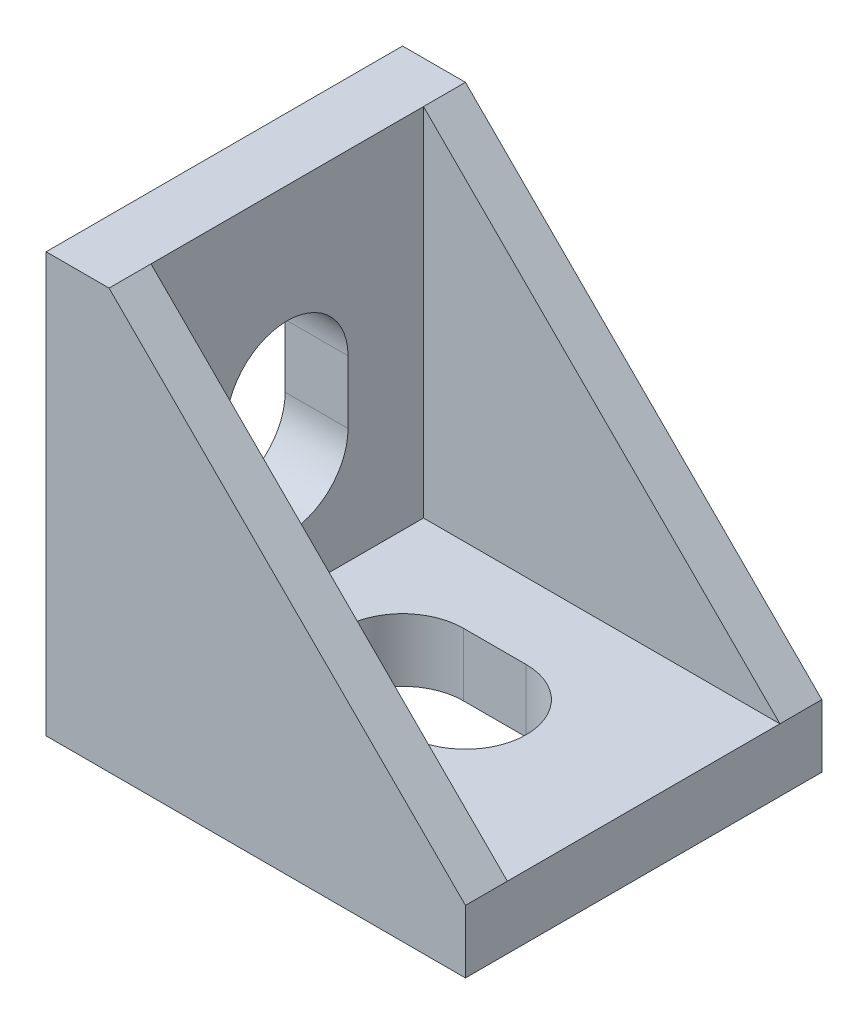
ISO-10303-21;
HEADER;
FILE_DESCRIPTION(('STEP AP214'),'2;1');
FILE_NAME('part.step','',(''),(''),'','','');
FILE_SCHEMA(('AUTOMOTIVE_DESIGN { 1 0 10303 214 1 1 1 1 }'));
ENDSEC;
DATA;
#1=APPLICATION_CONTEXT('core data for automotive mechanical design processes');
#2=APPLICATION_PROTOCOL_DEFINITION('international standard','automotive_design',2000,#1);
#3=PRODUCT_CONTEXT('',#1,'mechanical');
#4=PRODUCT('Part','Part','',(#3));
#5=PRODUCT_RELATED_PRODUCT_CATEGORY('part','',(#4));
#6=PRODUCT_DEFINITION_FORMATION('','',#4);
#7=PRODUCT_DEFINITION_CONTEXT('part definition',#1,'design');
#8=PRODUCT_DEFINITION('design','',#6,#7);
#9=PRODUCT_DEFINITION_SHAPE('','',#8);
#10=(LENGTH_UNIT() NAMED_UNIT(*) SI_UNIT(.MILLI.,.METRE.));
#11=(NAMED_UNIT(*) PLANE_ANGLE_UNIT() SI_UNIT($,.RADIAN.));
#12=(NAMED_UNIT(*) SI_UNIT($,.STERADIAN.) SOLID_ANGLE_UNIT());
#13=UNCERTAINTY_MEASURE_WITH_UNIT(LENGTH_MEASURE(1.E-05),#10,'distance_accuracy_value','');
#14=(GEOMETRIC_REPRESENTATION_CONTEXT(3) GLOBAL_UNCERTAINTY_ASSIGNED_CONTEXT((#13)) GLOBAL_UNIT_ASSIGNED_CONTEXT((#10,
#11,#12)) REPRESENTATION_CONTEXT('',''));
#15=CARTESIAN_POINT('',(0.,0.,0.));
#16=DIRECTION('',(0.,0.,1.));
#17=DIRECTION('',(1.,0.,0.));
#18=AXIS2_PLACEMENT_3D('',#15,#16,#17);
#19=CARTESIAN_POINT('',(0.,0.,8.5));
#20=DIRECTION('',(1.,0.,0.));
#21=DIRECTION('',(0.,0.,-1.));
#22=AXIS2_PLACEMENT_3D('',#19,#20,#21);
#23=PLANE('',#22);
#24=DIRECTION('',(0.,1.,0.));
#25=VECTOR('',#24,1.);
#26=CARTESIAN_POINT('',(0.,18.5,2.));
#27=LINE('',#26,#25);
#28=CARTESIAN_POINT('',(0.,16.65,2.));
#29=VERTEX_POINT('',#28);
#30=CARTESIAN_POINT('',(0.,18.5,2.));
#31=VERTEX_POINT('',#30);
#32=EDGE_CURVE('E221',#29,#31,#27,.T.);
#33=ORIENTED_EDGE('',*,*,#32,.F.);
#34=DIRECTION('',(0.,0.,1.));
#35=VECTOR('',#34,1.);
#36=CARTESIAN_POINT('',(0.,16.65,-2.));
#37=LINE('',#36,#35);
#38=CARTESIAN_POINT('',(0.,16.65,-2.));
#39=VERTEX_POINT('',#38);
#40=EDGE_CURVE('E234',#39,#29,#37,.T.);
#41=ORIENTED_EDGE('',*,*,#40,.F.);
#42=DIRECTION('',(0.,-1.,0.));
#43=VECTOR('',#42,1.);
#44=CARTESIAN_POINT('',(0.,18.5,-2.));
#45=LINE('',#44,#43);
#46=CARTESIAN_POINT('',(0.,18.5,-2.));
#47=VERTEX_POINT('',#46);
#48=EDGE_CURVE('E243',#47,#39,#45,.T.);
#49=ORIENTED_EDGE('',*,*,#48,.F.);
#50=DIRECTION('',(0.,0.,-1.));
#51=VECTOR('',#50,1.);
#52=CARTESIAN_POINT('',(0.,18.5,-2.));
#53=LINE('',#52,#51);
#54=EDGE_CURVE('E224',#31,#47,#53,.T.);
#55=ORIENTED_EDGE('',*,*,#54,.F.);
#56=EDGE_LOOP('',(#33,#41,#49,#55));
#57=FACE_BOUND('',#56,.T.);
#58=DIRECTION('',(0.,1.,0.));
#59=VECTOR('',#58,1.);
#60=CARTESIAN_POINT('',(0.,11.5,-2.9));
#61=LINE('',#60,#59);
#62=CARTESIAN_POINT('',(0.,8.5,-2.9));
#63=VERTEX_POINT('',#62);
#64=CARTESIAN_POINT('',(0.,11.5,-2.9));
#65=VERTEX_POINT('',#64);
#66=EDGE_CURVE('E302',#63,#65,#61,.T.);
#67=ORIENTED_EDGE('',*,*,#66,.T.);
#68=CARTESIAN_POINT('',(0.,11.5,0.));
#69=DIRECTION('',(1.,0.,0.));
#70=DIRECTION('',(0.,1.,0.));
#71=AXIS2_PLACEMENT_3D('',#68,#69,#70);
#72=CIRCLE('',#71,2.9);
#73=CARTESIAN_POINT('',(0.,11.5,2.9));
#74=VERTEX_POINT('',#73);
#75=EDGE_CURVE('E292',#65,#74,#72,.T.);
#76=ORIENTED_EDGE('',*,*,#75,.T.);
#77=DIRECTION('',(0.,-1.,0.));
#78=VECTOR('',#77,1.);
#79=CARTESIAN_POINT('',(0.,11.5,2.9));
#80=LINE('',#79,#78);
#81=CARTESIAN_POINT('',(0.,8.5,2.9));
#82=VERTEX_POINT('',#81);
#83=EDGE_CURVE('E295',#74,#82,#80,.T.);
#84=ORIENTED_EDGE('',*,*,#83,.T.);
#85=CARTESIAN_POINT('',(0.,8.5,0.));
#86=DIRECTION('',(1.,0.,0.));
#87=DIRECTION('',(0.,1.,0.));
#88=AXIS2_PLACEMENT_3D('',#85,#86,#87);
#89=CIRCLE('',#88,2.9);
#90=EDGE_CURVE('E299',#82,#63,#89,.T.);
#91=ORIENTED_EDGE('',*,*,#90,.T.);
#92=EDGE_LOOP('',(#67,#76,#84,#91));
#93=FACE_BOUND('',#92,.T.);
#94=DIRECTION('',(0.,-1.,0.));
#95=VECTOR('',#94,1.);
#96=CARTESIAN_POINT('',(0.,0.,-8.5));
#97=LINE('',#96,#95);
#98=CARTESIAN_POINT('',(0.,20.,-8.5));
#99=VERTEX_POINT('',#98);
#100=CARTESIAN_POINT('',(0.,0.,-8.5));
#101=VERTEX_POINT('',#100);
#102=EDGE_CURVE('E352',#99,#101,#97,.T.);
#103=ORIENTED_EDGE('',*,*,#102,.T.);
#104=DIRECTION('',(0.,0.,-1.));
#105=VECTOR('',#104,1.);
#106=CARTESIAN_POINT('',(0.,0.,8.5));
#107=LINE('',#106,#105);
#108=CARTESIAN_POINT('',(0.,0.,8.5));
#109=VERTEX_POINT('',#108);
#110=EDGE_CURVE('E360',#109,#101,#107,.T.);
#111=ORIENTED_EDGE('',*,*,#110,.F.);
#112=DIRECTION('',(0.,-1.,0.));
#113=VECTOR('',#112,1.);
#114=CARTESIAN_POINT('',(0.,0.,8.5));
#115=LINE('',#114,#113);
#116=CARTESIAN_POINT('',(0.,20.,8.5));
#117=VERTEX_POINT('',#116);
#118=EDGE_CURVE('E358',#117,#109,#115,.T.);
#119=ORIENTED_EDGE('',*,*,#118,.F.);
#120=DIRECTION('',(0.,0.,-1.));
#121=VECTOR('',#120,1.);
#122=CARTESIAN_POINT('',(0.,20.,8.5));
#123=LINE('',#122,#121);
#124=EDGE_CURVE('E374',#117,#99,#123,.T.);
#125=ORIENTED_EDGE('',*,*,#124,.T.);
#126=EDGE_LOOP('',(#103,#111,#119,#125));
#127=FACE_BOUND('',#126,.T.);
#128=DIRECTION('',(0.,-1.,0.));
#129=VECTOR('',#128,1.);
#130=CARTESIAN_POINT('',(0.,1.5,-2.));
#131=LINE('',#130,#129);
#132=CARTESIAN_POINT('',(0.,3.35,-2.));
#133=VERTEX_POINT('',#132);
#134=CARTESIAN_POINT('',(0.,1.5,-2.));
#135=VERTEX_POINT('',#134);
#136=EDGE_CURVE('E220',#133,#135,#131,.T.);
#137=ORIENTED_EDGE('',*,*,#136,.F.);
#138=DIRECTION('',(0.,0.,-1.));
#139=VECTOR('',#138,1.);
#140=CARTESIAN_POINT('',(0.,3.35,-2.));
#141=LINE('',#140,#139);
#142=CARTESIAN_POINT('',(0.,3.35,2.));
#143=VERTEX_POINT('',#142);
#144=EDGE_CURVE('E217',#143,#133,#141,.T.);
#145=ORIENTED_EDGE('',*,*,#144,.F.);
#146=DIRECTION('',(0.,1.,0.));
#147=VECTOR('',#146,1.);
#148=CARTESIAN_POINT('',(0.,1.5,2.));
#149=LINE('',#148,#147);
#150=CARTESIAN_POINT('',(0.,1.5,2.));
#151=VERTEX_POINT('',#150);
#152=EDGE_CURVE('E59',#151,#143,#149,.T.);
#153=ORIENTED_EDGE('',*,*,#152,.F.);
#154=DIRECTION('',(0.,0.,1.));
#155=VECTOR('',#154,1.);
#156=CARTESIAN_POINT('',(0.,1.5,-2.));
#157=LINE('',#156,#155);
#158=EDGE_CURVE('E54',#135,#151,#157,.T.);
#159=ORIENTED_EDGE('',*,*,#158,.F.);
#160=EDGE_LOOP('',(#137,#145,#153,#159));
#161=FACE_BOUND('',#160,.T.);
#162=ADVANCED_FACE('F39',(#57,#93,#127,#161),#23,.F.);
#163=CARTESIAN_POINT('',(3.,20.,8.5));
#164=DIRECTION('',(-0.707106781186548,-0.707106781186548,0.));
#165=DIRECTION('',(0.707106781186548,-0.707106781186548,0.));
#166=AXIS2_PLACEMENT_3D('',#163,#164,#165);
#167=PLANE('',#166);
#168=DIRECTION('',(-0.707106781186547,0.707106781186547,0.));
#169=VECTOR('',#168,1.);
#170=CARTESIAN_POINT('',(3.,20.,6.5));
#171=LINE('',#170,#169);
#172=CARTESIAN_POINT('',(20.,3.,6.5));
#173=VERTEX_POINT('',#172);
#174=CARTESIAN_POINT('',(3.,20.,6.5));
#175=VERTEX_POINT('',#174);
#176=EDGE_CURVE('E317',#173,#175,#171,.T.);
#177=ORIENTED_EDGE('',*,*,#176,.T.);
#178=DIRECTION('',(0.,0.,-1.));
#179=VECTOR('',#178,1.);
#180=CARTESIAN_POINT('',(3.,20.,8.5));
#181=LINE('',#180,#179);
#182=CARTESIAN_POINT('',(3.,20.,8.5));
#183=VERTEX_POINT('',#182);
#184=EDGE_CURVE('E378',#183,#175,#181,.T.);
#185=ORIENTED_EDGE('',*,*,#184,.F.);
#186=DIRECTION('',(-0.707106781186547,0.707106781186547,0.));
#187=VECTOR('',#186,1.);
#188=CARTESIAN_POINT('',(3.,20.,8.5));
#189=LINE('',#188,#187);
#190=CARTESIAN_POINT('',(20.,3.,8.5));
#191=VERTEX_POINT('',#190);
#192=EDGE_CURVE('E354',#191,#183,#189,.T.);
#193=ORIENTED_EDGE('',*,*,#192,.F.);
#194=DIRECTION('',(0.,0.,-1.));
#195=VECTOR('',#194,1.);
#196=CARTESIAN_POINT('',(20.,3.,8.5));
#197=LINE('',#196,#195);
#198=EDGE_CURVE('E47',#191,#173,#197,.T.);
#199=ORIENTED_EDGE('',*,*,#198,.T.);
#200=EDGE_LOOP('',(#177,#185,#193,#199));
#201=FACE_BOUND('',#200,.T.);
#202=ADVANCED_FACE('F411',(#201),#167,.F.);
#203=CARTESIAN_POINT('',(20.,0.,8.5));
#204=DIRECTION('',(0.,1.,0.));
#205=DIRECTION('',(-1.,0.,0.));
#206=AXIS2_PLACEMENT_3D('',#203,#204,#205);
#207=PLANE('',#206);
#208=DIRECTION('',(1.,0.,0.));
#209=VECTOR('',#208,1.);
#210=CARTESIAN_POINT('',(11.5,0.,2.9));
#211=LINE('',#210,#209);
#212=CARTESIAN_POINT('',(8.5,0.,2.9));
#213=VERTEX_POINT('',#212);
#214=CARTESIAN_POINT('',(11.5,0.,2.9));
#215=VERTEX_POINT('',#214);
#216=EDGE_CURVE('E270',#213,#215,#211,.T.);
#217=ORIENTED_EDGE('',*,*,#216,.T.);
#218=CARTESIAN_POINT('',(11.5,0.,0.));
#219=DIRECTION('',(0.,1.,0.));
#220=DIRECTION('',(-1.,0.,0.));
#221=AXIS2_PLACEMENT_3D('',#218,#219,#220);
#222=CIRCLE('',#221,2.9);
#223=CARTESIAN_POINT('',(11.5,0.,-2.9));
#224=VERTEX_POINT('',#223);
#225=EDGE_CURVE('E260',#215,#224,#222,.T.);
#226=ORIENTED_EDGE('',*,*,#225,.T.);
#227=DIRECTION('',(-1.,0.,0.));
#228=VECTOR('',#227,1.);
#229=CARTESIAN_POINT('',(11.5,0.,-2.9));
#230=LINE('',#229,#228);
#231=CARTESIAN_POINT('',(8.5,0.,-2.9));
#232=VERTEX_POINT('',#231);
#233=EDGE_CURVE('E263',#224,#232,#230,.T.);
#234=ORIENTED_EDGE('',*,*,#233,.T.);
#235=CARTESIAN_POINT('',(8.5,0.,0.));
#236=DIRECTION('',(0.,1.,0.));
#237=DIRECTION('',(-1.,0.,0.));
#238=AXIS2_PLACEMENT_3D('',#235,#236,#237);
#239=CIRCLE('',#238,2.9);
#240=EDGE_CURVE('E267',#232,#213,#239,.T.);
#241=ORIENTED_EDGE('',*,*,#240,.T.);
#242=EDGE_LOOP('',(#217,#226,#234,#241));
#243=FACE_BOUND('',#242,.T.);
#244=DIRECTION('',(1.,0.,0.));
#245=VECTOR('',#244,1.);
#246=CARTESIAN_POINT('',(20.,0.,-8.5));
#247=LINE('',#246,#245);
#248=CARTESIAN_POINT('',(20.,0.,-8.5));
#249=VERTEX_POINT('',#248);
#250=EDGE_CURVE('E344',#101,#249,#247,.T.);
#251=ORIENTED_EDGE('',*,*,#250,.T.);
#252=DIRECTION('',(0.,0.,-1.));
#253=VECTOR('',#252,1.);
#254=CARTESIAN_POINT('',(20.,0.,8.5));
#255=LINE('',#254,#253);
#256=CARTESIAN_POINT('',(20.,0.,8.5));
#257=VERTEX_POINT('',#256);
#258=EDGE_CURVE('E11',#257,#249,#255,.T.);
#259=ORIENTED_EDGE('',*,*,#258,.F.);
#260=DIRECTION('',(1.,0.,0.));
#261=VECTOR('',#260,1.);
#262=CARTESIAN_POINT('',(20.,0.,8.5));
#263=LINE('',#262,#261);
#264=EDGE_CURVE('E348',#109,#257,#263,.T.);
#265=ORIENTED_EDGE('',*,*,#264,.F.);
#266=ORIENTED_EDGE('',*,*,#110,.T.);
#267=EDGE_LOOP('',(#251,#259,#265,#266));
#268=FACE_BOUND('',#267,.T.);
#269=ADVANCED_FACE('F41',(#243,#268),#207,.F.);
#270=CARTESIAN_POINT('',(20.,3.,8.5));
#271=DIRECTION('',(-1.,0.,0.));
#272=DIRECTION('',(0.,0.,1.));
#273=AXIS2_PLACEMENT_3D('',#270,#271,#272);
#274=PLANE('',#273);
#275=DIRECTION('',(0.,1.,0.));
#276=VECTOR('',#275,1.);
#277=CARTESIAN_POINT('',(20.,3.,-8.5));
#278=LINE('',#277,#276);
#279=CARTESIAN_POINT('',(20.,3.,-8.5));
#280=VERTEX_POINT('',#279);
#281=EDGE_CURVE('E363',#249,#280,#278,.T.);
#282=ORIENTED_EDGE('',*,*,#281,.T.);
#283=CARTESIAN_POINT('',(20.,3.,-6.5));
#284=VERTEX_POINT('',#283);
#285=EDGE_CURVE('E380',#284,#280,#197,.T.);
#286=ORIENTED_EDGE('',*,*,#285,.F.);
#287=DIRECTION('',(0.,0.,1.));
#288=VECTOR('',#287,1.);
#289=CARTESIAN_POINT('',(20.,3.,-6.5));
#290=LINE('',#289,#288);
#291=EDGE_CURVE('E341',#284,#173,#290,.T.);
#292=ORIENTED_EDGE('',*,*,#291,.T.);
#293=ORIENTED_EDGE('',*,*,#198,.F.);
#294=DIRECTION('',(0.,1.,0.));
#295=VECTOR('',#294,1.);
#296=CARTESIAN_POINT('',(20.,3.,8.5));
#297=LINE('',#296,#295);
#298=EDGE_CURVE('E351',#257,#191,#297,.T.);
#299=ORIENTED_EDGE('',*,*,#298,.F.);
#300=ORIENTED_EDGE('',*,*,#258,.T.);
#301=EDGE_LOOP('',(#282,#286,#292,#293,#299,#300));
#302=FACE_BOUND('',#301,.T.);
#303=ADVANCED_FACE('F393',(#302),#274,.F.);
#304=CARTESIAN_POINT('',(3.,20.,-6.5));
#305=VERTEX_POINT('',#304);
#306=CARTESIAN_POINT('',(3.,20.,-8.5));
#307=VERTEX_POINT('',#306);
#308=EDGE_CURVE('E377',#305,#307,#181,.T.);
#309=ORIENTED_EDGE('',*,*,#308,.F.);
#310=DIRECTION('',(-0.707106781186547,0.707106781186547,0.));
#311=VECTOR('',#310,1.);
#312=CARTESIAN_POINT('',(3.,20.,-6.5));
#313=LINE('',#312,#311);
#314=EDGE_CURVE('E324',#284,#305,#313,.T.);
#315=ORIENTED_EDGE('',*,*,#314,.F.);
#316=ORIENTED_EDGE('',*,*,#285,.T.);
#317=DIRECTION('',(-0.707106781186547,0.707106781186547,0.));
#318=VECTOR('',#317,1.);
#319=CARTESIAN_POINT('',(3.,20.,-8.5));
#320=LINE('',#319,#318);
#321=EDGE_CURVE('E366',#280,#307,#320,.T.);
#322=ORIENTED_EDGE('',*,*,#321,.T.);
#323=EDGE_LOOP('',(#309,#315,#316,#322));
#324=FACE_BOUND('',#323,.T.);
#325=ADVANCED_FACE('F389',(#324),#167,.F.);
#326=CARTESIAN_POINT('',(0.,20.,8.5));
#327=DIRECTION('',(0.,-1.,0.));
#328=DIRECTION('',(0.,0.,-1.));
#329=AXIS2_PLACEMENT_3D('',#326,#327,#328);
#330=PLANE('',#329);
#331=DIRECTION('',(-1.,0.,0.));
#332=VECTOR('',#331,1.);
#333=CARTESIAN_POINT('',(0.,20.,-8.5));
#334=LINE('',#333,#332);
#335=EDGE_CURVE('E369',#307,#99,#334,.T.);
#336=ORIENTED_EDGE('',*,*,#335,.T.);
#337=ORIENTED_EDGE('',*,*,#124,.F.);
#338=DIRECTION('',(-1.,0.,0.));
#339=VECTOR('',#338,1.);
#340=CARTESIAN_POINT('',(0.,20.,8.5));
#341=LINE('',#340,#339);
#342=EDGE_CURVE('E356',#183,#117,#341,.T.);
#343=ORIENTED_EDGE('',*,*,#342,.F.);
#344=ORIENTED_EDGE('',*,*,#184,.T.);
#345=DIRECTION('',(0.,0.,1.));
#346=VECTOR('',#345,1.);
#347=CARTESIAN_POINT('',(3.,20.,-6.5));
#348=LINE('',#347,#346);
#349=EDGE_CURVE('E333',#305,#175,#348,.T.);
#350=ORIENTED_EDGE('',*,*,#349,.F.);
#351=ORIENTED_EDGE('',*,*,#308,.T.);
#352=EDGE_LOOP('',(#336,#337,#343,#344,#350,#351));
#353=FACE_BOUND('',#352,.T.);
#354=ADVANCED_FACE('F401',(#353),#330,.F.);
#355=CARTESIAN_POINT('',(0.,0.,8.5));
#356=DIRECTION('',(0.,0.,-1.));
#357=DIRECTION('',(-1.,0.,0.));
#358=AXIS2_PLACEMENT_3D('',#355,#356,#357);
#359=PLANE('',#358);
#360=ORIENTED_EDGE('',*,*,#264,.T.);
#361=ORIENTED_EDGE('',*,*,#298,.T.);
#362=ORIENTED_EDGE('',*,*,#192,.T.);
#363=ORIENTED_EDGE('',*,*,#342,.T.);
#364=ORIENTED_EDGE('',*,*,#118,.T.);
#365=EDGE_LOOP('',(#360,#361,#362,#363,#364));
#366=FACE_BOUND('',#365,.T.);
#367=ADVANCED_FACE('F409',(#366),#359,.F.);
#368=CARTESIAN_POINT('',(0.,0.,-8.5));
#369=DIRECTION('',(0.,0.,-1.));
#370=DIRECTION('',(-1.,0.,0.));
#371=AXIS2_PLACEMENT_3D('',#368,#369,#370);
#372=PLANE('',#371);
#373=ORIENTED_EDGE('',*,*,#250,.F.);
#374=ORIENTED_EDGE('',*,*,#102,.F.);
#375=ORIENTED_EDGE('',*,*,#335,.F.);
#376=ORIENTED_EDGE('',*,*,#321,.F.);
#377=ORIENTED_EDGE('',*,*,#281,.F.);
#378=EDGE_LOOP('',(#373,#374,#375,#376,#377));
#379=FACE_BOUND('',#378,.T.);
#380=ADVANCED_FACE('F397',(#379),#372,.T.);
#381=CARTESIAN_POINT('',(20.,3.,-6.5));
#382=DIRECTION('',(0.,-1.,0.));
#383=DIRECTION('',(1.,0.,0.));
#384=AXIS2_PLACEMENT_3D('',#381,#382,#383);
#385=PLANE('',#384);
#386=DIRECTION('',(-1.,0.,0.));
#387=VECTOR('',#386,1.);
#388=CARTESIAN_POINT('',(11.5,3.,-2.9));
#389=LINE('',#388,#387);
#390=CARTESIAN_POINT('',(11.5,3.,-2.9));
#391=VERTEX_POINT('',#390);
#392=CARTESIAN_POINT('',(8.5,3.,-2.9));
#393=VERTEX_POINT('',#392);
#394=EDGE_CURVE('E275',#391,#393,#389,.T.);
#395=ORIENTED_EDGE('',*,*,#394,.F.);
#396=CARTESIAN_POINT('',(11.5,3.,0.));
#397=DIRECTION('',(0.,1.,0.));
#398=DIRECTION('',(-1.,0.,0.));
#399=AXIS2_PLACEMENT_3D('',#396,#397,#398);
#400=CIRCLE('',#399,2.9);
#401=CARTESIAN_POINT('',(11.5,3.,2.9));
#402=VERTEX_POINT('',#401);
#403=EDGE_CURVE('E259',#402,#391,#400,.T.);
#404=ORIENTED_EDGE('',*,*,#403,.F.);
#405=DIRECTION('',(1.,0.,0.));
#406=VECTOR('',#405,1.);
#407=CARTESIAN_POINT('',(11.5,3.,2.9));
#408=LINE('',#407,#406);
#409=CARTESIAN_POINT('',(8.5,3.,2.9));
#410=VERTEX_POINT('',#409);
#411=EDGE_CURVE('E264',#410,#402,#408,.T.);
#412=ORIENTED_EDGE('',*,*,#411,.F.);
#413=CARTESIAN_POINT('',(8.5,3.,0.));
#414=DIRECTION('',(0.,1.,0.));
#415=DIRECTION('',(-1.,0.,0.));
#416=AXIS2_PLACEMENT_3D('',#413,#414,#415);
#417=CIRCLE('',#416,2.9);
#418=EDGE_CURVE('E278',#393,#410,#417,.T.);
#419=ORIENTED_EDGE('',*,*,#418,.F.);
#420=EDGE_LOOP('',(#395,#404,#412,#419));
#421=FACE_BOUND('',#420,.T.);
#422=DIRECTION('',(1.,0.,0.));
#423=VECTOR('',#422,1.);
#424=CARTESIAN_POINT('',(20.,3.,6.5));
#425=LINE('',#424,#423);
#426=CARTESIAN_POINT('',(3.,3.,6.5));
#427=VERTEX_POINT('',#426);
#428=EDGE_CURVE('E327',#427,#173,#425,.T.);
#429=ORIENTED_EDGE('',*,*,#428,.T.);
#430=ORIENTED_EDGE('',*,*,#291,.F.);
#431=DIRECTION('',(1.,0.,0.));
#432=VECTOR('',#431,1.);
#433=CARTESIAN_POINT('',(20.,3.,-6.5));
#434=LINE('',#433,#432);
#435=CARTESIAN_POINT('',(3.,3.,-6.5));
#436=VERTEX_POINT('',#435);
#437=EDGE_CURVE('E330',#436,#284,#434,.T.);
#438=ORIENTED_EDGE('',*,*,#437,.F.);
#439=DIRECTION('',(0.,0.,1.));
#440=VECTOR('',#439,1.);
#441=CARTESIAN_POINT('',(3.,3.,-6.5));
#442=LINE('',#441,#440);
#443=EDGE_CURVE('E345',#436,#427,#442,.T.);
#444=ORIENTED_EDGE('',*,*,#443,.T.);
#445=EDGE_LOOP('',(#429,#430,#438,#444));
#446=FACE_BOUND('',#445,.T.);
#447=ADVANCED_FACE('F417',(#421,#446),#385,.F.);
#448=CARTESIAN_POINT('',(3.,20.,-6.5));
#449=DIRECTION('',(-1.,0.,0.));
#450=DIRECTION('',(0.,-1.,0.));
#451=AXIS2_PLACEMENT_3D('',#448,#449,#450);
#452=PLANE('',#451);
#453=DIRECTION('',(0.,-1.,0.));
#454=VECTOR('',#453,1.);
#455=CARTESIAN_POINT('',(3.,11.5,2.9));
#456=LINE('',#455,#454);
#457=CARTESIAN_POINT('',(3.,11.5,2.9));
#458=VERTEX_POINT('',#457);
#459=CARTESIAN_POINT('',(3.,8.5,2.9));
#460=VERTEX_POINT('',#459);
#461=EDGE_CURVE('E307',#458,#460,#456,.T.);
#462=ORIENTED_EDGE('',*,*,#461,.F.);
#463=CARTESIAN_POINT('',(3.,11.5,0.));
#464=DIRECTION('',(1.,0.,0.));
#465=DIRECTION('',(0.,1.,0.));
#466=AXIS2_PLACEMENT_3D('',#463,#464,#465);
#467=CIRCLE('',#466,2.9);
#468=CARTESIAN_POINT('',(3.,11.5,-2.9));
#469=VERTEX_POINT('',#468);
#470=EDGE_CURVE('E285',#469,#458,#467,.T.);
#471=ORIENTED_EDGE('',*,*,#470,.F.);
#472=DIRECTION('',(0.,1.,0.));
#473=VECTOR('',#472,1.);
#474=CARTESIAN_POINT('',(3.,11.5,-2.9));
#475=LINE('',#474,#473);
#476=CARTESIAN_POINT('',(3.,8.5,-2.9));
#477=VERTEX_POINT('',#476);
#478=EDGE_CURVE('E296',#477,#469,#475,.T.);
#479=ORIENTED_EDGE('',*,*,#478,.F.);
#480=CARTESIAN_POINT('',(3.,8.5,0.));
#481=DIRECTION('',(1.,0.,0.));
#482=DIRECTION('',(0.,1.,0.));
#483=AXIS2_PLACEMENT_3D('',#480,#481,#482);
#484=CIRCLE('',#483,2.9);
#485=EDGE_CURVE('E310',#460,#477,#484,.T.);
#486=ORIENTED_EDGE('',*,*,#485,.F.);
#487=EDGE_LOOP('',(#462,#471,#479,#486));
#488=FACE_BOUND('',#487,.T.);
#489=DIRECTION('',(0.,-1.,0.));
#490=VECTOR('',#489,1.);
#491=CARTESIAN_POINT('',(3.,20.,6.5));
#492=LINE('',#491,#490);
#493=EDGE_CURVE('E336',#175,#427,#492,.T.);
#494=ORIENTED_EDGE('',*,*,#493,.T.);
#495=ORIENTED_EDGE('',*,*,#443,.F.);
#496=DIRECTION('',(0.,-1.,0.));
#497=VECTOR('',#496,1.);
#498=CARTESIAN_POINT('',(3.,20.,-6.5));
#499=LINE('',#498,#497);
#500=EDGE_CURVE('E326',#305,#436,#499,.T.);
#501=ORIENTED_EDGE('',*,*,#500,.F.);
#502=ORIENTED_EDGE('',*,*,#349,.T.);
#503=EDGE_LOOP('',(#494,#495,#501,#502));
#504=FACE_BOUND('',#503,.T.);
#505=ADVANCED_FACE('F421',(#488,#504),#452,.F.);
#506=CARTESIAN_POINT('',(0.,0.,-6.5));
#507=DIRECTION('',(0.,0.,-1.));
#508=DIRECTION('',(-1.,0.,0.));
#509=AXIS2_PLACEMENT_3D('',#506,#507,#508);
#510=PLANE('',#509);
#511=ORIENTED_EDGE('',*,*,#314,.T.);
#512=ORIENTED_EDGE('',*,*,#500,.T.);
#513=ORIENTED_EDGE('',*,*,#437,.T.);
#514=EDGE_LOOP('',(#511,#512,#513));
#515=FACE_BOUND('',#514,.T.);
#516=ADVANCED_FACE('F423',(#515),#510,.F.);
#517=CARTESIAN_POINT('',(0.,0.,6.5));
#518=DIRECTION('',(0.,0.,-1.));
#519=DIRECTION('',(-1.,0.,0.));
#520=AXIS2_PLACEMENT_3D('',#517,#518,#519);
#521=PLANE('',#520);
#522=ORIENTED_EDGE('',*,*,#176,.F.);
#523=ORIENTED_EDGE('',*,*,#428,.F.);
#524=ORIENTED_EDGE('',*,*,#493,.F.);
#525=EDGE_LOOP('',(#522,#523,#524));
#526=FACE_BOUND('',#525,.T.);
#527=ADVANCED_FACE('F415',(#526),#521,.T.);
#528=CARTESIAN_POINT('',(0.,11.5,0.));
#529=DIRECTION('',(1.,0.,0.));
#530=DIRECTION('',(0.,1.,0.));
#531=AXIS2_PLACEMENT_3D('',#528,#529,#530);
#532=CYLINDRICAL_SURFACE('',#531,2.9);
#533=ORIENTED_EDGE('',*,*,#470,.T.);
#534=DIRECTION('',(1.,0.,0.));
#535=VECTOR('',#534,1.);
#536=CARTESIAN_POINT('',(0.,11.5,2.9));
#537=LINE('',#536,#535);
#538=EDGE_CURVE('E305',#74,#458,#537,.T.);
#539=ORIENTED_EDGE('',*,*,#538,.F.);
#540=ORIENTED_EDGE('',*,*,#75,.F.);
#541=DIRECTION('',(1.,0.,0.));
#542=VECTOR('',#541,1.);
#543=CARTESIAN_POINT('',(0.,11.5,-2.9));
#544=LINE('',#543,#542);
#545=EDGE_CURVE('E315',#65,#469,#544,.T.);
#546=ORIENTED_EDGE('',*,*,#545,.T.);
#547=EDGE_LOOP('',(#533,#539,#540,#546));
#548=FACE_BOUND('',#547,.T.);
#549=ADVANCED_FACE('F430',(#548),#532,.F.);
#550=CARTESIAN_POINT('',(0.,11.5,-2.9));
#551=DIRECTION('',(0.,0.,-1.));
#552=DIRECTION('',(0.,1.,0.));
#553=AXIS2_PLACEMENT_3D('',#550,#551,#552);
#554=PLANE('',#553);
#555=ORIENTED_EDGE('',*,*,#478,.T.);
#556=ORIENTED_EDGE('',*,*,#545,.F.);
#557=ORIENTED_EDGE('',*,*,#66,.F.);
#558=DIRECTION('',(1.,0.,0.));
#559=VECTOR('',#558,1.);
#560=CARTESIAN_POINT('',(0.,8.5,-2.9));
#561=LINE('',#560,#559);
#562=EDGE_CURVE('E318',#63,#477,#561,.T.);
#563=ORIENTED_EDGE('',*,*,#562,.T.);
#564=EDGE_LOOP('',(#555,#556,#557,#563));
#565=FACE_BOUND('',#564,.T.);
#566=ADVANCED_FACE('F513',(#565),#554,.F.);
#567=CARTESIAN_POINT('',(0.,8.5,0.));
#568=DIRECTION('',(1.,0.,0.));
#569=DIRECTION('',(0.,1.,0.));
#570=AXIS2_PLACEMENT_3D('',#567,#568,#569);
#571=CYLINDRICAL_SURFACE('',#570,2.9);
#572=ORIENTED_EDGE('',*,*,#485,.T.);
#573=ORIENTED_EDGE('',*,*,#562,.F.);
#574=ORIENTED_EDGE('',*,*,#90,.F.);
#575=DIRECTION('',(1.,0.,0.));
#576=VECTOR('',#575,1.);
#577=CARTESIAN_POINT('',(0.,8.5,2.9));
#578=LINE('',#577,#576);
#579=EDGE_CURVE('E320',#82,#460,#578,.T.);
#580=ORIENTED_EDGE('',*,*,#579,.T.);
#581=EDGE_LOOP('',(#572,#573,#574,#580));
#582=FACE_BOUND('',#581,.T.);
#583=ADVANCED_FACE('F520',(#582),#571,.F.);
#584=CARTESIAN_POINT('',(0.,11.5,2.9));
#585=DIRECTION('',(0.,0.,1.));
#586=DIRECTION('',(1.,0.,0.));
#587=AXIS2_PLACEMENT_3D('',#584,#585,#586);
#588=PLANE('',#587);
#589=ORIENTED_EDGE('',*,*,#461,.T.);
#590=ORIENTED_EDGE('',*,*,#579,.F.);
#591=ORIENTED_EDGE('',*,*,#83,.F.);
#592=ORIENTED_EDGE('',*,*,#538,.T.);
#593=EDGE_LOOP('',(#589,#590,#591,#592));
#594=FACE_BOUND('',#593,.T.);
#595=ADVANCED_FACE('F528',(#594),#588,.F.);
#596=CARTESIAN_POINT('',(11.5,0.,0.));
#597=DIRECTION('',(0.,1.,0.));
#598=DIRECTION('',(-1.,0.,0.));
#599=AXIS2_PLACEMENT_3D('',#596,#597,#598);
#600=CYLINDRICAL_SURFACE('',#599,2.9);
#601=ORIENTED_EDGE('',*,*,#403,.T.);
#602=DIRECTION('',(0.,1.,0.));
#603=VECTOR('',#602,1.);
#604=CARTESIAN_POINT('',(11.5,0.,-2.9));
#605=LINE('',#604,#603);
#606=EDGE_CURVE('E273',#224,#391,#605,.T.);
#607=ORIENTED_EDGE('',*,*,#606,.F.);
#608=ORIENTED_EDGE('',*,*,#225,.F.);
#609=DIRECTION('',(0.,1.,0.));
#610=VECTOR('',#609,1.);
#611=CARTESIAN_POINT('',(11.5,0.,2.9));
#612=LINE('',#611,#610);
#613=EDGE_CURVE('E283',#215,#402,#612,.T.);
#614=ORIENTED_EDGE('',*,*,#613,.T.);
#615=EDGE_LOOP('',(#601,#607,#608,#614));
#616=FACE_BOUND('',#615,.T.);
#617=ADVANCED_FACE('F467',(#616),#600,.F.);
#618=CARTESIAN_POINT('',(11.5,0.,2.9));
#619=DIRECTION('',(0.,0.,1.));
#620=DIRECTION('',(1.,0.,0.));
#621=AXIS2_PLACEMENT_3D('',#618,#619,#620);
#622=PLANE('',#621);
#623=ORIENTED_EDGE('',*,*,#411,.T.);
#624=ORIENTED_EDGE('',*,*,#613,.F.);
#625=ORIENTED_EDGE('',*,*,#216,.F.);
#626=DIRECTION('',(0.,1.,0.));
#627=VECTOR('',#626,1.);
#628=CARTESIAN_POINT('',(8.5,0.,2.9));
#629=LINE('',#628,#627);
#630=EDGE_CURVE('E286',#213,#410,#629,.T.);
#631=ORIENTED_EDGE('',*,*,#630,.T.);
#632=EDGE_LOOP('',(#623,#624,#625,#631));
#633=FACE_BOUND('',#632,.T.);
#634=ADVANCED_FACE('F463',(#633),#622,.F.);
#635=CARTESIAN_POINT('',(8.5,0.,0.));
#636=DIRECTION('',(0.,1.,0.));
#637=DIRECTION('',(-1.,0.,0.));
#638=AXIS2_PLACEMENT_3D('',#635,#636,#637);
#639=CYLINDRICAL_SURFACE('',#638,2.9);
#640=ORIENTED_EDGE('',*,*,#418,.T.);
#641=ORIENTED_EDGE('',*,*,#630,.F.);
#642=ORIENTED_EDGE('',*,*,#240,.F.);
#643=DIRECTION('',(0.,1.,0.));
#644=VECTOR('',#643,1.);
#645=CARTESIAN_POINT('',(8.5,0.,-2.9));
#646=LINE('',#645,#644);
#647=EDGE_CURVE('E288',#232,#393,#646,.T.);
#648=ORIENTED_EDGE('',*,*,#647,.T.);
#649=EDGE_LOOP('',(#640,#641,#642,#648));
#650=FACE_BOUND('',#649,.T.);
#651=ADVANCED_FACE('F475',(#650),#639,.F.);
#652=CARTESIAN_POINT('',(11.5,0.,-2.9));
#653=DIRECTION('',(0.,0.,-1.));
#654=DIRECTION('',(-1.,0.,0.));
#655=AXIS2_PLACEMENT_3D('',#652,#653,#654);
#656=PLANE('',#655);
#657=ORIENTED_EDGE('',*,*,#394,.T.);
#658=ORIENTED_EDGE('',*,*,#647,.F.);
#659=ORIENTED_EDGE('',*,*,#233,.F.);
#660=ORIENTED_EDGE('',*,*,#606,.T.);
#661=EDGE_LOOP('',(#657,#658,#659,#660));
#662=FACE_BOUND('',#661,.T.);
#663=ADVANCED_FACE('F472',(#662),#656,.F.);
#664=CARTESIAN_POINT('',(-1.,18.5,2.));
#665=DIRECTION('',(0.,0.,-1.));
#666=DIRECTION('',(0.,1.,0.));
#667=AXIS2_PLACEMENT_3D('',#664,#665,#666);
#668=PLANE('',#667);
#669=ORIENTED_EDGE('',*,*,#32,.T.);
#670=DIRECTION('',(1.,0.,0.));
#671=VECTOR('',#670,1.);
#672=CARTESIAN_POINT('',(-1.,18.5,2.));
#673=LINE('',#672,#671);
#674=CARTESIAN_POINT('',(-1.,18.5,2.));
#675=VERTEX_POINT('',#674);
#676=EDGE_CURVE('E256',#675,#31,#673,.T.);
#677=ORIENTED_EDGE('',*,*,#676,.F.);
#678=DIRECTION('',(0.,1.,0.));
#679=VECTOR('',#678,1.);
#680=CARTESIAN_POINT('',(-1.,18.5,2.));
#681=LINE('',#680,#679);
#682=CARTESIAN_POINT('',(-1.,16.65,2.));
#683=VERTEX_POINT('',#682);
#684=EDGE_CURVE('E230',#683,#675,#681,.T.);
#685=ORIENTED_EDGE('',*,*,#684,.F.);
#686=DIRECTION('',(1.,0.,0.));
#687=VECTOR('',#686,1.);
#688=CARTESIAN_POINT('',(-1.,16.65,2.));
#689=LINE('',#688,#687);
#690=EDGE_CURVE('E239',#683,#29,#689,.T.);
#691=ORIENTED_EDGE('',*,*,#690,.T.);
#692=EDGE_LOOP('',(#669,#677,#685,#691));
#693=FACE_BOUND('',#692,.T.);
#694=ADVANCED_FACE('F557',(#693),#668,.F.);
#695=CARTESIAN_POINT('',(-1.,18.5,-2.));
#696=DIRECTION('',(0.,-1.,0.));
#697=DIRECTION('',(0.,0.,-1.));
#698=AXIS2_PLACEMENT_3D('',#695,#696,#697);
#699=PLANE('',#698);
#700=ORIENTED_EDGE('',*,*,#54,.T.);
#701=DIRECTION('',(1.,0.,0.));
#702=VECTOR('',#701,1.);
#703=CARTESIAN_POINT('',(-1.,18.5,-2.));
#704=LINE('',#703,#702);
#705=CARTESIAN_POINT('',(-1.,18.5,-2.));
#706=VERTEX_POINT('',#705);
#707=EDGE_CURVE('E253',#706,#47,#704,.T.);
#708=ORIENTED_EDGE('',*,*,#707,.F.);
#709=DIRECTION('',(0.,0.,-1.));
#710=VECTOR('',#709,1.);
#711=CARTESIAN_POINT('',(-1.,18.5,-2.));
#712=LINE('',#711,#710);
#713=EDGE_CURVE('E233',#675,#706,#712,.T.);
#714=ORIENTED_EDGE('',*,*,#713,.F.);
#715=ORIENTED_EDGE('',*,*,#676,.T.);
#716=EDGE_LOOP('',(#700,#708,#714,#715));
#717=FACE_BOUND('',#716,.T.);
#718=ADVANCED_FACE('F567',(#717),#699,.F.);
#719=CARTESIAN_POINT('',(-1.,18.5,-2.));
#720=DIRECTION('',(0.,0.,1.));
#721=DIRECTION('',(0.,-1.,0.));
#722=AXIS2_PLACEMENT_3D('',#719,#720,#721);
#723=PLANE('',#722);
#724=ORIENTED_EDGE('',*,*,#48,.T.);
#725=DIRECTION('',(1.,0.,0.));
#726=VECTOR('',#725,1.);
#727=CARTESIAN_POINT('',(-1.,16.65,-2.));
#728=LINE('',#727,#726);
#729=CARTESIAN_POINT('',(-1.,16.65,-2.));
#730=VERTEX_POINT('',#729);
#731=EDGE_CURVE('E250',#730,#39,#728,.T.);
#732=ORIENTED_EDGE('',*,*,#731,.F.);
#733=DIRECTION('',(0.,-1.,0.));
#734=VECTOR('',#733,1.);
#735=CARTESIAN_POINT('',(-1.,18.5,-2.));
#736=LINE('',#735,#734);
#737=EDGE_CURVE('E236',#706,#730,#736,.T.);
#738=ORIENTED_EDGE('',*,*,#737,.F.);
#739=ORIENTED_EDGE('',*,*,#707,.T.);
#740=EDGE_LOOP('',(#724,#732,#738,#739));
#741=FACE_BOUND('',#740,.T.);
#742=ADVANCED_FACE('F577',(#741),#723,.F.);
#743=CARTESIAN_POINT('',(-1.,16.65,-2.));
#744=DIRECTION('',(0.,1.,0.));
#745=DIRECTION('',(0.,0.,1.));
#746=AXIS2_PLACEMENT_3D('',#743,#744,#745);
#747=PLANE('',#746);
#748=ORIENTED_EDGE('',*,*,#40,.T.);
#749=ORIENTED_EDGE('',*,*,#690,.F.);
#750=DIRECTION('',(0.,0.,1.));
#751=VECTOR('',#750,1.);
#752=CARTESIAN_POINT('',(-1.,16.65,-2.));
#753=LINE('',#752,#751);
#754=EDGE_CURVE('E238',#730,#683,#753,.T.);
#755=ORIENTED_EDGE('',*,*,#754,.F.);
#756=ORIENTED_EDGE('',*,*,#731,.T.);
#757=EDGE_LOOP('',(#748,#749,#755,#756));
#758=FACE_BOUND('',#757,.T.);
#759=ADVANCED_FACE('F587',(#758),#747,.F.);
#760=CARTESIAN_POINT('',(-1.,0.,0.));
#761=DIRECTION('',(-1.,0.,0.));
#762=DIRECTION('',(0.,0.,1.));
#763=AXIS2_PLACEMENT_3D('',#760,#761,#762);
#764=PLANE('',#763);
#765=ORIENTED_EDGE('',*,*,#684,.T.);
#766=ORIENTED_EDGE('',*,*,#713,.T.);
#767=ORIENTED_EDGE('',*,*,#737,.T.);
#768=ORIENTED_EDGE('',*,*,#754,.T.);
#769=EDGE_LOOP('',(#765,#766,#767,#768));
#770=FACE_BOUND('',#769,.T.);
#771=ADVANCED_FACE('F597',(#770),#764,.T.);
#772=CARTESIAN_POINT('',(-1.,1.5,-2.));
#773=DIRECTION('',(0.,0.,1.));
#774=DIRECTION('',(0.,-1.,0.));
#775=AXIS2_PLACEMENT_3D('',#772,#773,#774);
#776=PLANE('',#775);
#777=ORIENTED_EDGE('',*,*,#136,.T.);
#778=DIRECTION('',(1.,0.,0.));
#779=VECTOR('',#778,1.);
#780=CARTESIAN_POINT('',(-1.,1.5,-2.));
#781=LINE('',#780,#779);
#782=CARTESIAN_POINT('',(-1.,1.5,-2.));
#783=VERTEX_POINT('',#782);
#784=EDGE_CURVE('E201',#783,#135,#781,.T.);
#785=ORIENTED_EDGE('',*,*,#784,.F.);
#786=DIRECTION('',(0.,-1.,0.));
#787=VECTOR('',#786,1.);
#788=CARTESIAN_POINT('',(-1.,1.5,-2.));
#789=LINE('',#788,#787);
#790=CARTESIAN_POINT('',(-1.,3.35,-2.));
#791=VERTEX_POINT('',#790);
#792=EDGE_CURVE('E208',#791,#783,#789,.T.);
#793=ORIENTED_EDGE('',*,*,#792,.F.);
#794=DIRECTION('',(1.,0.,0.));
#795=VECTOR('',#794,1.);
#796=CARTESIAN_POINT('',(-1.,3.35,-2.));
#797=LINE('',#796,#795);
#798=EDGE_CURVE('E656',#791,#133,#797,.T.);
#799=ORIENTED_EDGE('',*,*,#798,.T.);
#800=EDGE_LOOP('',(#777,#785,#793,#799));
#801=FACE_BOUND('',#800,.T.);
#802=ADVANCED_FACE('F219',(#801),#776,.F.);
#803=CARTESIAN_POINT('',(-1.,1.5,-2.));
#804=DIRECTION('',(0.,1.,0.));
#805=DIRECTION('',(0.,0.,1.));
#806=AXIS2_PLACEMENT_3D('',#803,#804,#805);
#807=PLANE('',#806);
#808=ORIENTED_EDGE('',*,*,#158,.T.);
#809=DIRECTION('',(1.,0.,0.));
#810=VECTOR('',#809,1.);
#811=CARTESIAN_POINT('',(-1.,1.5,2.));
#812=LINE('',#811,#810);
#813=CARTESIAN_POINT('',(-1.,1.5,2.));
#814=VERTEX_POINT('',#813);
#815=EDGE_CURVE('E204',#814,#151,#812,.T.);
#816=ORIENTED_EDGE('',*,*,#815,.F.);
#817=DIRECTION('',(0.,0.,1.));
#818=VECTOR('',#817,1.);
#819=CARTESIAN_POINT('',(-1.,1.5,-2.));
#820=LINE('',#819,#818);
#821=EDGE_CURVE('E197',#783,#814,#820,.T.);
#822=ORIENTED_EDGE('',*,*,#821,.F.);
#823=ORIENTED_EDGE('',*,*,#784,.T.);
#824=EDGE_LOOP('',(#808,#816,#822,#823));
#825=FACE_BOUND('',#824,.T.);
#826=ADVANCED_FACE('F199',(#825),#807,.F.);
#827=CARTESIAN_POINT('',(-1.,1.5,2.));
#828=DIRECTION('',(0.,0.,-1.));
#829=DIRECTION('',(0.,1.,0.));
#830=AXIS2_PLACEMENT_3D('',#827,#828,#829);
#831=PLANE('',#830);
#832=ORIENTED_EDGE('',*,*,#152,.T.);
#833=DIRECTION('',(1.,0.,0.));
#834=VECTOR('',#833,1.);
#835=CARTESIAN_POINT('',(-1.,3.35,2.));
#836=LINE('',#835,#834);
#837=CARTESIAN_POINT('',(-1.,3.35,2.));
#838=VERTEX_POINT('',#837);
#839=EDGE_CURVE('E226',#838,#143,#836,.T.);
#840=ORIENTED_EDGE('',*,*,#839,.F.);
#841=DIRECTION('',(0.,1.,0.));
#842=VECTOR('',#841,1.);
#843=CARTESIAN_POINT('',(-1.,1.5,2.));
#844=LINE('',#843,#842);
#845=EDGE_CURVE('E207',#814,#838,#844,.T.);
#846=ORIENTED_EDGE('',*,*,#845,.F.);
#847=ORIENTED_EDGE('',*,*,#815,.T.);
#848=EDGE_LOOP('',(#832,#840,#846,#847));
#849=FACE_BOUND('',#848,.T.);
#850=ADVANCED_FACE('F624',(#849),#831,.F.);
#851=CARTESIAN_POINT('',(-1.,3.35,-2.));
#852=DIRECTION('',(0.,-1.,0.));
#853=DIRECTION('',(0.,0.,-1.));
#854=AXIS2_PLACEMENT_3D('',#851,#852,#853);
#855=PLANE('',#854);
#856=ORIENTED_EDGE('',*,*,#144,.T.);
#857=ORIENTED_EDGE('',*,*,#798,.F.);
#858=DIRECTION('',(0.,0.,-1.));
#859=VECTOR('',#858,1.);
#860=CARTESIAN_POINT('',(-1.,3.35,-2.));
#861=LINE('',#860,#859);
#862=EDGE_CURVE('E213',#838,#791,#861,.T.);
#863=ORIENTED_EDGE('',*,*,#862,.F.);
#864=ORIENTED_EDGE('',*,*,#839,.T.);
#865=EDGE_LOOP('',(#856,#857,#863,#864));
#866=FACE_BOUND('',#865,.T.);
#867=ADVANCED_FACE('F633',(#866),#855,.F.);
#868=CARTESIAN_POINT('',(-1.,0.,0.));
#869=DIRECTION('',(1.,0.,0.));
#870=DIRECTION('',(0.,0.,-1.));
#871=AXIS2_PLACEMENT_3D('',#868,#869,#870);
#872=PLANE('',#871);
#873=ORIENTED_EDGE('',*,*,#792,.T.);
#874=ORIENTED_EDGE('',*,*,#821,.T.);
#875=ORIENTED_EDGE('',*,*,#845,.T.);
#876=ORIENTED_EDGE('',*,*,#862,.T.);
#877=EDGE_LOOP('',(#873,#874,#875,#876));
#878=FACE_BOUND('',#877,.T.);
#879=ADVANCED_FACE('F211',(#878),#872,.F.);
#880=CLOSED_SHELL('',(#162,#202,#269,#303,#325,#354,#367,#380,#447,#505,#516,#527,#549,#566,
#583,#595,#617,#634,#651,#663,#694,#718,#742,#759,#771,#802,#826,#850,#867,#879));
#881=MANIFOLD_SOLID_BREP('B2',#880);
#882=ADVANCED_BREP_SHAPE_REPRESENTATION('',(#18,#881),#14);
#883=SHAPE_DEFINITION_REPRESENTATION(#9,#882);
ENDSEC;
END-ISO-10303-21;
